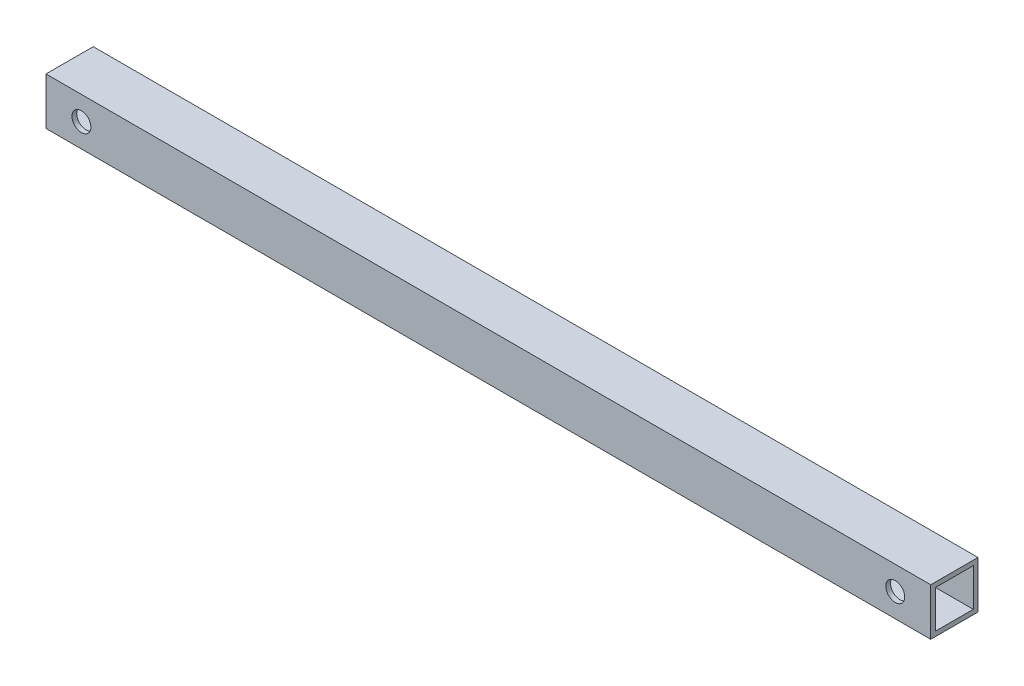
ISO-10303-21;
HEADER;
FILE_DESCRIPTION(('STEP AP214'),'2;1');
FILE_NAME('part.step','',(''),(''),'','','');
FILE_SCHEMA(('AUTOMOTIVE_DESIGN { 1 0 10303 214 1 1 1 1 }'));
ENDSEC;
DATA;
#1=APPLICATION_CONTEXT('core data for automotive mechanical design processes');
#2=APPLICATION_PROTOCOL_DEFINITION('international standard','automotive_design',2000,#1);
#3=PRODUCT_CONTEXT('',#1,'mechanical');
#4=PRODUCT('Part','Part','',(#3));
#5=PRODUCT_RELATED_PRODUCT_CATEGORY('part','',(#4));
#6=PRODUCT_DEFINITION_FORMATION('','',#4);
#7=PRODUCT_DEFINITION_CONTEXT('part definition',#1,'design');
#8=PRODUCT_DEFINITION('design','',#6,#7);
#9=PRODUCT_DEFINITION_SHAPE('','',#8);
#10=(LENGTH_UNIT() NAMED_UNIT(*) SI_UNIT(.MILLI.,.METRE.));
#11=(NAMED_UNIT(*) PLANE_ANGLE_UNIT() SI_UNIT($,.RADIAN.));
#12=(NAMED_UNIT(*) SI_UNIT($,.STERADIAN.) SOLID_ANGLE_UNIT());
#13=UNCERTAINTY_MEASURE_WITH_UNIT(LENGTH_MEASURE(1.E-05),#10,'distance_accuracy_value','');
#14=(GEOMETRIC_REPRESENTATION_CONTEXT(3) GLOBAL_UNCERTAINTY_ASSIGNED_CONTEXT((#13)) GLOBAL_UNIT_ASSIGNED_CONTEXT((#10,
#11,#12)) REPRESENTATION_CONTEXT('',''));
#15=CARTESIAN_POINT('',(0.,0.,0.));
#16=DIRECTION('',(0.,0.,1.));
#17=DIRECTION('',(1.,0.,0.));
#18=AXIS2_PLACEMENT_3D('',#15,#16,#17);
#19=CARTESIAN_POINT('',(187.2,0.,0.));
#20=DIRECTION('',(1.,0.,0.));
#21=DIRECTION('',(0.,0.,-1.));
#22=AXIS2_PLACEMENT_3D('',#19,#20,#21);
#23=PLANE('',#22);
#24=DIRECTION('',(0.,1.,0.));
#25=VECTOR('',#24,1.);
#26=CARTESIAN_POINT('',(187.2,-5.,-5.));
#27=LINE('',#26,#25);
#28=CARTESIAN_POINT('',(187.2,-5.,-5.));
#29=VERTEX_POINT('',#28);
#30=CARTESIAN_POINT('',(187.2,5.,-5.));
#31=VERTEX_POINT('',#30);
#32=EDGE_CURVE('E162',#29,#31,#27,.T.);
#33=ORIENTED_EDGE('',*,*,#32,.T.);
#34=DIRECTION('',(0.,0.,1.));
#35=VECTOR('',#34,1.);
#36=CARTESIAN_POINT('',(187.2,5.,5.));
#37=LINE('',#36,#35);
#38=CARTESIAN_POINT('',(187.2,5.,5.));
#39=VERTEX_POINT('',#38);
#40=EDGE_CURVE('E165',#31,#39,#37,.T.);
#41=ORIENTED_EDGE('',*,*,#40,.T.);
#42=DIRECTION('',(0.,-1.,0.));
#43=VECTOR('',#42,1.);
#44=CARTESIAN_POINT('',(187.2,-5.,5.));
#45=LINE('',#44,#43);
#46=CARTESIAN_POINT('',(187.2,-5.,5.));
#47=VERTEX_POINT('',#46);
#48=EDGE_CURVE('E168',#39,#47,#45,.T.);
#49=ORIENTED_EDGE('',*,*,#48,.T.);
#50=DIRECTION('',(0.,0.,-1.));
#51=VECTOR('',#50,1.);
#52=CARTESIAN_POINT('',(187.2,-5.,5.));
#53=LINE('',#52,#51);
#54=EDGE_CURVE('E170',#47,#29,#53,.T.);
#55=ORIENTED_EDGE('',*,*,#54,.T.);
#56=EDGE_LOOP('',(#33,#41,#49,#55));
#57=FACE_BOUND('',#56,.T.);
#58=DIRECTION('',(0.,0.,1.));
#59=VECTOR('',#58,1.);
#60=CARTESIAN_POINT('',(187.2,4.,0.));
#61=LINE('',#60,#59);
#62=CARTESIAN_POINT('',(187.2,4.,-4.));
#63=VERTEX_POINT('',#62);
#64=CARTESIAN_POINT('',(187.2,4.,4.));
#65=VERTEX_POINT('',#64);
#66=EDGE_CURVE('E132',#63,#65,#61,.T.);
#67=ORIENTED_EDGE('',*,*,#66,.F.);
#68=DIRECTION('',(0.,1.,0.));
#69=VECTOR('',#68,1.);
#70=CARTESIAN_POINT('',(187.2,0.,-4.));
#71=LINE('',#70,#69);
#72=CARTESIAN_POINT('',(187.2,-4.,-4.));
#73=VERTEX_POINT('',#72);
#74=EDGE_CURVE('E124',#73,#63,#71,.T.);
#75=ORIENTED_EDGE('',*,*,#74,.F.);
#76=DIRECTION('',(0.,0.,-1.));
#77=VECTOR('',#76,1.);
#78=CARTESIAN_POINT('',(187.2,-4.,0.));
#79=LINE('',#78,#77);
#80=CARTESIAN_POINT('',(187.2,-4.,4.));
#81=VERTEX_POINT('',#80);
#82=EDGE_CURVE('E146',#81,#73,#79,.T.);
#83=ORIENTED_EDGE('',*,*,#82,.F.);
#84=DIRECTION('',(0.,-1.,0.));
#85=VECTOR('',#84,1.);
#86=CARTESIAN_POINT('',(187.2,0.,4.));
#87=LINE('',#86,#85);
#88=EDGE_CURVE('E144',#65,#81,#87,.T.);
#89=ORIENTED_EDGE('',*,*,#88,.F.);
#90=EDGE_LOOP('',(#67,#75,#83,#89));
#91=FACE_BOUND('',#90,.T.);
#92=ADVANCED_FACE('F57',(#57,#91),#23,.T.);
#93=CARTESIAN_POINT('',(0.,0.,0.));
#94=DIRECTION('',(1.,0.,0.));
#95=DIRECTION('',(0.,0.,-1.));
#96=AXIS2_PLACEMENT_3D('',#93,#94,#95);
#97=PLANE('',#96);
#98=DIRECTION('',(0.,1.,0.));
#99=VECTOR('',#98,1.);
#100=CARTESIAN_POINT('',(0.,-5.,-5.));
#101=LINE('',#100,#99);
#102=CARTESIAN_POINT('',(0.,-5.,-5.));
#103=VERTEX_POINT('',#102);
#104=CARTESIAN_POINT('',(0.,5.,-5.));
#105=VERTEX_POINT('',#104);
#106=EDGE_CURVE('E140',#103,#105,#101,.T.);
#107=ORIENTED_EDGE('',*,*,#106,.F.);
#108=DIRECTION('',(0.,0.,-1.));
#109=VECTOR('',#108,1.);
#110=CARTESIAN_POINT('',(0.,-5.,5.));
#111=LINE('',#110,#109);
#112=CARTESIAN_POINT('',(0.,-5.,5.));
#113=VERTEX_POINT('',#112);
#114=EDGE_CURVE('E166',#113,#103,#111,.T.);
#115=ORIENTED_EDGE('',*,*,#114,.F.);
#116=DIRECTION('',(0.,-1.,0.));
#117=VECTOR('',#116,1.);
#118=CARTESIAN_POINT('',(0.,-5.,5.));
#119=LINE('',#118,#117);
#120=CARTESIAN_POINT('',(0.,5.,5.));
#121=VERTEX_POINT('',#120);
#122=EDGE_CURVE('E177',#121,#113,#119,.T.);
#123=ORIENTED_EDGE('',*,*,#122,.F.);
#124=DIRECTION('',(0.,0.,1.));
#125=VECTOR('',#124,1.);
#126=CARTESIAN_POINT('',(0.,5.,5.));
#127=LINE('',#126,#125);
#128=EDGE_CURVE('E175',#105,#121,#127,.T.);
#129=ORIENTED_EDGE('',*,*,#128,.F.);
#130=EDGE_LOOP('',(#107,#115,#123,#129));
#131=FACE_BOUND('',#130,.T.);
#132=DIRECTION('',(0.,1.,0.));
#133=VECTOR('',#132,1.);
#134=CARTESIAN_POINT('',(0.,0.,-4.));
#135=LINE('',#134,#133);
#136=CARTESIAN_POINT('',(0.,-4.,-4.));
#137=VERTEX_POINT('',#136);
#138=CARTESIAN_POINT('',(0.,4.,-4.));
#139=VERTEX_POINT('',#138);
#140=EDGE_CURVE('E82',#137,#139,#135,.T.);
#141=ORIENTED_EDGE('',*,*,#140,.T.);
#142=DIRECTION('',(0.,0.,1.));
#143=VECTOR('',#142,1.);
#144=CARTESIAN_POINT('',(0.,4.,0.));
#145=LINE('',#144,#143);
#146=CARTESIAN_POINT('',(0.,4.,4.));
#147=VERTEX_POINT('',#146);
#148=EDGE_CURVE('E139',#139,#147,#145,.T.);
#149=ORIENTED_EDGE('',*,*,#148,.T.);
#150=DIRECTION('',(0.,-1.,0.));
#151=VECTOR('',#150,1.);
#152=CARTESIAN_POINT('',(0.,0.,4.));
#153=LINE('',#152,#151);
#154=CARTESIAN_POINT('',(0.,-4.,4.));
#155=VERTEX_POINT('',#154);
#156=EDGE_CURVE('E154',#147,#155,#153,.T.);
#157=ORIENTED_EDGE('',*,*,#156,.T.);
#158=DIRECTION('',(0.,0.,-1.));
#159=VECTOR('',#158,1.);
#160=CARTESIAN_POINT('',(0.,-4.,0.));
#161=LINE('',#160,#159);
#162=EDGE_CURVE('E133',#155,#137,#161,.T.);
#163=ORIENTED_EDGE('',*,*,#162,.T.);
#164=EDGE_LOOP('',(#141,#149,#157,#163));
#165=FACE_BOUND('',#164,.T.);
#166=ADVANCED_FACE('F224',(#131,#165),#97,.F.);
#167=CARTESIAN_POINT('',(187.2,-5.,-5.));
#168=DIRECTION('',(0.,0.,1.));
#169=DIRECTION('',(1.,0.,0.));
#170=AXIS2_PLACEMENT_3D('',#167,#168,#169);
#171=PLANE('',#170);
#172=CARTESIAN_POINT('',(7.5,0.,-5.));
#173=DIRECTION('',(0.,0.,1.));
#174=DIRECTION('',(1.,0.,0.));
#175=AXIS2_PLACEMENT_3D('',#172,#173,#174);
#176=CIRCLE('',#175,2.);
#177=CARTESIAN_POINT('',(9.5,0.,-5.));
#178=VERTEX_POINT('',#177);
#179=EDGE_CURVE('E189',#178,#178,#176,.T.);
#180=ORIENTED_EDGE('',*,*,#179,.T.);
#181=EDGE_LOOP('',(#180));
#182=FACE_BOUND('',#181,.T.);
#183=CARTESIAN_POINT('',(179.7,0.,-5.));
#184=DIRECTION('',(0.,0.,1.));
#185=DIRECTION('',(-1.,0.,0.));
#186=AXIS2_PLACEMENT_3D('',#183,#184,#185);
#187=CIRCLE('',#186,2.);
#188=CARTESIAN_POINT('',(177.7,0.,-5.));
#189=VERTEX_POINT('',#188);
#190=EDGE_CURVE('E200',#189,#189,#187,.T.);
#191=ORIENTED_EDGE('',*,*,#190,.T.);
#192=EDGE_LOOP('',(#191));
#193=FACE_BOUND('',#192,.T.);
#194=ORIENTED_EDGE('',*,*,#106,.T.);
#195=DIRECTION('',(-1.,0.,0.));
#196=VECTOR('',#195,1.);
#197=CARTESIAN_POINT('',(187.2,5.,-5.));
#198=LINE('',#197,#196);
#199=EDGE_CURVE('E12',#31,#105,#198,.T.);
#200=ORIENTED_EDGE('',*,*,#199,.F.);
#201=ORIENTED_EDGE('',*,*,#32,.F.);
#202=DIRECTION('',(-1.,0.,0.));
#203=VECTOR('',#202,1.);
#204=CARTESIAN_POINT('',(187.2,-5.,-5.));
#205=LINE('',#204,#203);
#206=EDGE_CURVE('E172',#29,#103,#205,.T.);
#207=ORIENTED_EDGE('',*,*,#206,.T.);
#208=EDGE_LOOP('',(#194,#200,#201,#207));
#209=FACE_BOUND('',#208,.T.);
#210=ADVANCED_FACE('F59',(#182,#193,#209),#171,.F.);
#211=CARTESIAN_POINT('',(187.2,5.,5.));
#212=DIRECTION('',(0.,-1.,0.));
#213=DIRECTION('',(0.,0.,-1.));
#214=AXIS2_PLACEMENT_3D('',#211,#212,#213);
#215=PLANE('',#214);
#216=ORIENTED_EDGE('',*,*,#128,.T.);
#217=DIRECTION('',(-1.,0.,0.));
#218=VECTOR('',#217,1.);
#219=CARTESIAN_POINT('',(187.2,5.,5.));
#220=LINE('',#219,#218);
#221=EDGE_CURVE('E66',#39,#121,#220,.T.);
#222=ORIENTED_EDGE('',*,*,#221,.F.);
#223=ORIENTED_EDGE('',*,*,#40,.F.);
#224=ORIENTED_EDGE('',*,*,#199,.T.);
#225=EDGE_LOOP('',(#216,#222,#223,#224));
#226=FACE_BOUND('',#225,.T.);
#227=ADVANCED_FACE('F250',(#226),#215,.F.);
#228=CARTESIAN_POINT('',(187.2,-5.,5.));
#229=DIRECTION('',(0.,0.,-1.));
#230=DIRECTION('',(-1.,0.,0.));
#231=AXIS2_PLACEMENT_3D('',#228,#229,#230);
#232=PLANE('',#231);
#233=CARTESIAN_POINT('',(7.5,0.,5.));
#234=DIRECTION('',(0.,0.,1.));
#235=DIRECTION('',(1.,0.,0.));
#236=AXIS2_PLACEMENT_3D('',#233,#234,#235);
#237=CIRCLE('',#236,2.);
#238=CARTESIAN_POINT('',(9.5,0.,5.));
#239=VERTEX_POINT('',#238);
#240=EDGE_CURVE('E195',#239,#239,#237,.T.);
#241=ORIENTED_EDGE('',*,*,#240,.F.);
#242=EDGE_LOOP('',(#241));
#243=FACE_BOUND('',#242,.T.);
#244=CARTESIAN_POINT('',(179.7,0.,5.));
#245=DIRECTION('',(0.,0.,1.));
#246=DIRECTION('',(-1.,0.,0.));
#247=AXIS2_PLACEMENT_3D('',#244,#245,#246);
#248=CIRCLE('',#247,2.);
#249=CARTESIAN_POINT('',(177.7,0.,5.));
#250=VERTEX_POINT('',#249);
#251=EDGE_CURVE('E205',#250,#250,#248,.T.);
#252=ORIENTED_EDGE('',*,*,#251,.F.);
#253=EDGE_LOOP('',(#252));
#254=FACE_BOUND('',#253,.T.);
#255=ORIENTED_EDGE('',*,*,#122,.T.);
#256=DIRECTION('',(-1.,0.,0.));
#257=VECTOR('',#256,1.);
#258=CARTESIAN_POINT('',(187.2,-5.,5.));
#259=LINE('',#258,#257);
#260=EDGE_CURVE('E182',#47,#113,#259,.T.);
#261=ORIENTED_EDGE('',*,*,#260,.F.);
#262=ORIENTED_EDGE('',*,*,#48,.F.);
#263=ORIENTED_EDGE('',*,*,#221,.T.);
#264=EDGE_LOOP('',(#255,#261,#262,#263));
#265=FACE_BOUND('',#264,.T.);
#266=ADVANCED_FACE('F247',(#243,#254,#265),#232,.F.);
#267=CARTESIAN_POINT('',(187.2,-5.,5.));
#268=DIRECTION('',(0.,1.,0.));
#269=DIRECTION('',(0.,0.,1.));
#270=AXIS2_PLACEMENT_3D('',#267,#268,#269);
#271=PLANE('',#270);
#272=ORIENTED_EDGE('',*,*,#114,.T.);
#273=ORIENTED_EDGE('',*,*,#206,.F.);
#274=ORIENTED_EDGE('',*,*,#54,.F.);
#275=ORIENTED_EDGE('',*,*,#260,.T.);
#276=EDGE_LOOP('',(#272,#273,#274,#275));
#277=FACE_BOUND('',#276,.T.);
#278=ADVANCED_FACE('F244',(#277),#271,.F.);
#279=CARTESIAN_POINT('',(187.2,0.,-4.));
#280=DIRECTION('',(0.,0.,1.));
#281=DIRECTION('',(1.,0.,0.));
#282=AXIS2_PLACEMENT_3D('',#279,#280,#281);
#283=PLANE('',#282);
#284=CARTESIAN_POINT('',(7.5,0.,-4.));
#285=DIRECTION('',(0.,0.,1.));
#286=DIRECTION('',(1.,0.,0.));
#287=AXIS2_PLACEMENT_3D('',#284,#285,#286);
#288=CIRCLE('',#287,2.);
#289=CARTESIAN_POINT('',(9.5,0.,-4.));
#290=VERTEX_POINT('',#289);
#291=EDGE_CURVE('E152',#290,#290,#288,.T.);
#292=ORIENTED_EDGE('',*,*,#291,.F.);
#293=EDGE_LOOP('',(#292));
#294=FACE_BOUND('',#293,.T.);
#295=CARTESIAN_POINT('',(179.7,0.,-4.));
#296=DIRECTION('',(0.,0.,1.));
#297=DIRECTION('',(1.,0.,0.));
#298=AXIS2_PLACEMENT_3D('',#295,#296,#297);
#299=CIRCLE('',#298,2.);
#300=CARTESIAN_POINT('',(181.7,0.,-4.));
#301=VERTEX_POINT('',#300);
#302=EDGE_CURVE('E188',#301,#301,#299,.T.);
#303=ORIENTED_EDGE('',*,*,#302,.F.);
#304=EDGE_LOOP('',(#303));
#305=FACE_BOUND('',#304,.T.);
#306=ORIENTED_EDGE('',*,*,#140,.F.);
#307=DIRECTION('',(-1.,0.,0.));
#308=VECTOR('',#307,1.);
#309=CARTESIAN_POINT('',(187.2,-4.,-4.));
#310=LINE('',#309,#308);
#311=EDGE_CURVE('E128',#73,#137,#310,.T.);
#312=ORIENTED_EDGE('',*,*,#311,.F.);
#313=ORIENTED_EDGE('',*,*,#74,.T.);
#314=DIRECTION('',(-1.,0.,0.));
#315=VECTOR('',#314,1.);
#316=CARTESIAN_POINT('',(187.2,4.,-4.));
#317=LINE('',#316,#315);
#318=EDGE_CURVE('E127',#63,#139,#317,.T.);
#319=ORIENTED_EDGE('',*,*,#318,.T.);
#320=EDGE_LOOP('',(#306,#312,#313,#319));
#321=FACE_BOUND('',#320,.T.);
#322=ADVANCED_FACE('F126',(#294,#305,#321),#283,.T.);
#323=CARTESIAN_POINT('',(187.2,4.,0.));
#324=DIRECTION('',(0.,-1.,0.));
#325=DIRECTION('',(0.,0.,-1.));
#326=AXIS2_PLACEMENT_3D('',#323,#324,#325);
#327=PLANE('',#326);
#328=ORIENTED_EDGE('',*,*,#148,.F.);
#329=ORIENTED_EDGE('',*,*,#318,.F.);
#330=ORIENTED_EDGE('',*,*,#66,.T.);
#331=DIRECTION('',(-1.,0.,0.));
#332=VECTOR('',#331,1.);
#333=CARTESIAN_POINT('',(187.2,4.,4.));
#334=LINE('',#333,#332);
#335=EDGE_CURVE('E141',#65,#147,#334,.T.);
#336=ORIENTED_EDGE('',*,*,#335,.T.);
#337=EDGE_LOOP('',(#328,#329,#330,#336));
#338=FACE_BOUND('',#337,.T.);
#339=ADVANCED_FACE('F136',(#338),#327,.T.);
#340=CARTESIAN_POINT('',(187.2,0.,4.));
#341=DIRECTION('',(0.,0.,-1.));
#342=DIRECTION('',(-1.,0.,0.));
#343=AXIS2_PLACEMENT_3D('',#340,#341,#342);
#344=PLANE('',#343);
#345=CARTESIAN_POINT('',(7.5,0.,4.));
#346=DIRECTION('',(0.,0.,-1.));
#347=DIRECTION('',(-1.,0.,0.));
#348=AXIS2_PLACEMENT_3D('',#345,#346,#347);
#349=CIRCLE('',#348,2.);
#350=CARTESIAN_POINT('',(5.5,0.,4.));
#351=VERTEX_POINT('',#350);
#352=EDGE_CURVE('E61',#351,#351,#349,.T.);
#353=ORIENTED_EDGE('',*,*,#352,.F.);
#354=EDGE_LOOP('',(#353));
#355=FACE_BOUND('',#354,.T.);
#356=CARTESIAN_POINT('',(179.7,0.,4.));
#357=DIRECTION('',(0.,0.,-1.));
#358=DIRECTION('',(-1.,0.,0.));
#359=AXIS2_PLACEMENT_3D('',#356,#357,#358);
#360=CIRCLE('',#359,2.);
#361=CARTESIAN_POINT('',(177.7,0.,4.));
#362=VERTEX_POINT('',#361);
#363=EDGE_CURVE('E186',#362,#362,#360,.T.);
#364=ORIENTED_EDGE('',*,*,#363,.F.);
#365=EDGE_LOOP('',(#364));
#366=FACE_BOUND('',#365,.T.);
#367=ORIENTED_EDGE('',*,*,#156,.F.);
#368=ORIENTED_EDGE('',*,*,#335,.F.);
#369=ORIENTED_EDGE('',*,*,#88,.T.);
#370=DIRECTION('',(-1.,0.,0.));
#371=VECTOR('',#370,1.);
#372=CARTESIAN_POINT('',(187.2,-4.,4.));
#373=LINE('',#372,#371);
#374=EDGE_CURVE('E74',#81,#155,#373,.T.);
#375=ORIENTED_EDGE('',*,*,#374,.T.);
#376=EDGE_LOOP('',(#367,#368,#369,#375));
#377=FACE_BOUND('',#376,.T.);
#378=ADVANCED_FACE('F216',(#355,#366,#377),#344,.T.);
#379=CARTESIAN_POINT('',(187.2,-4.,0.));
#380=DIRECTION('',(0.,1.,0.));
#381=DIRECTION('',(0.,0.,1.));
#382=AXIS2_PLACEMENT_3D('',#379,#380,#381);
#383=PLANE('',#382);
#384=ORIENTED_EDGE('',*,*,#162,.F.);
#385=ORIENTED_EDGE('',*,*,#374,.F.);
#386=ORIENTED_EDGE('',*,*,#82,.T.);
#387=ORIENTED_EDGE('',*,*,#311,.T.);
#388=EDGE_LOOP('',(#384,#385,#386,#387));
#389=FACE_BOUND('',#388,.T.);
#390=ADVANCED_FACE('F219',(#389),#383,.T.);
#391=CARTESIAN_POINT('',(179.7,0.,-5.));
#392=DIRECTION('',(0.,0.,1.));
#393=DIRECTION('',(1.,0.,0.));
#394=AXIS2_PLACEMENT_3D('',#391,#392,#393);
#395=CYLINDRICAL_SURFACE('',#394,2.);
#396=ORIENTED_EDGE('',*,*,#363,.T.);
#397=EDGE_LOOP('',(#396));
#398=FACE_BOUND('',#397,.T.);
#399=ORIENTED_EDGE('',*,*,#251,.T.);
#400=EDGE_LOOP('',(#399));
#401=FACE_BOUND('',#400,.T.);
#402=ADVANCED_FACE('F226',(#398,#401),#395,.F.);
#403=CARTESIAN_POINT('',(7.5,0.,-5.));
#404=DIRECTION('',(0.,0.,1.));
#405=DIRECTION('',(1.,0.,0.));
#406=AXIS2_PLACEMENT_3D('',#403,#404,#405);
#407=CYLINDRICAL_SURFACE('',#406,2.);
#408=ORIENTED_EDGE('',*,*,#352,.T.);
#409=EDGE_LOOP('',(#408));
#410=FACE_BOUND('',#409,.T.);
#411=ORIENTED_EDGE('',*,*,#240,.T.);
#412=EDGE_LOOP('',(#411));
#413=FACE_BOUND('',#412,.T.);
#414=ADVANCED_FACE('F213',(#410,#413),#407,.F.);
#415=ORIENTED_EDGE('',*,*,#302,.T.);
#416=EDGE_LOOP('',(#415));
#417=FACE_BOUND('',#416,.T.);
#418=ORIENTED_EDGE('',*,*,#190,.F.);
#419=EDGE_LOOP('',(#418));
#420=FACE_BOUND('',#419,.T.);
#421=ADVANCED_FACE('F232',(#417,#420),#395,.F.);
#422=ORIENTED_EDGE('',*,*,#291,.T.);
#423=EDGE_LOOP('',(#422));
#424=FACE_BOUND('',#423,.T.);
#425=ORIENTED_EDGE('',*,*,#179,.F.);
#426=EDGE_LOOP('',(#425));
#427=FACE_BOUND('',#426,.T.);
#428=ADVANCED_FACE('F275',(#424,#427),#407,.F.);
#429=CLOSED_SHELL('',(#92,#166,#210,#227,#266,#278,#322,#339,#378,#390,#402,#414,#421,#428));
#430=MANIFOLD_SOLID_BREP('B2',#429);
#431=ADVANCED_BREP_SHAPE_REPRESENTATION('',(#18,#430),#14);
#432=SHAPE_DEFINITION_REPRESENTATION(#9,#431);
ENDSEC;
END-ISO-10303-21;
